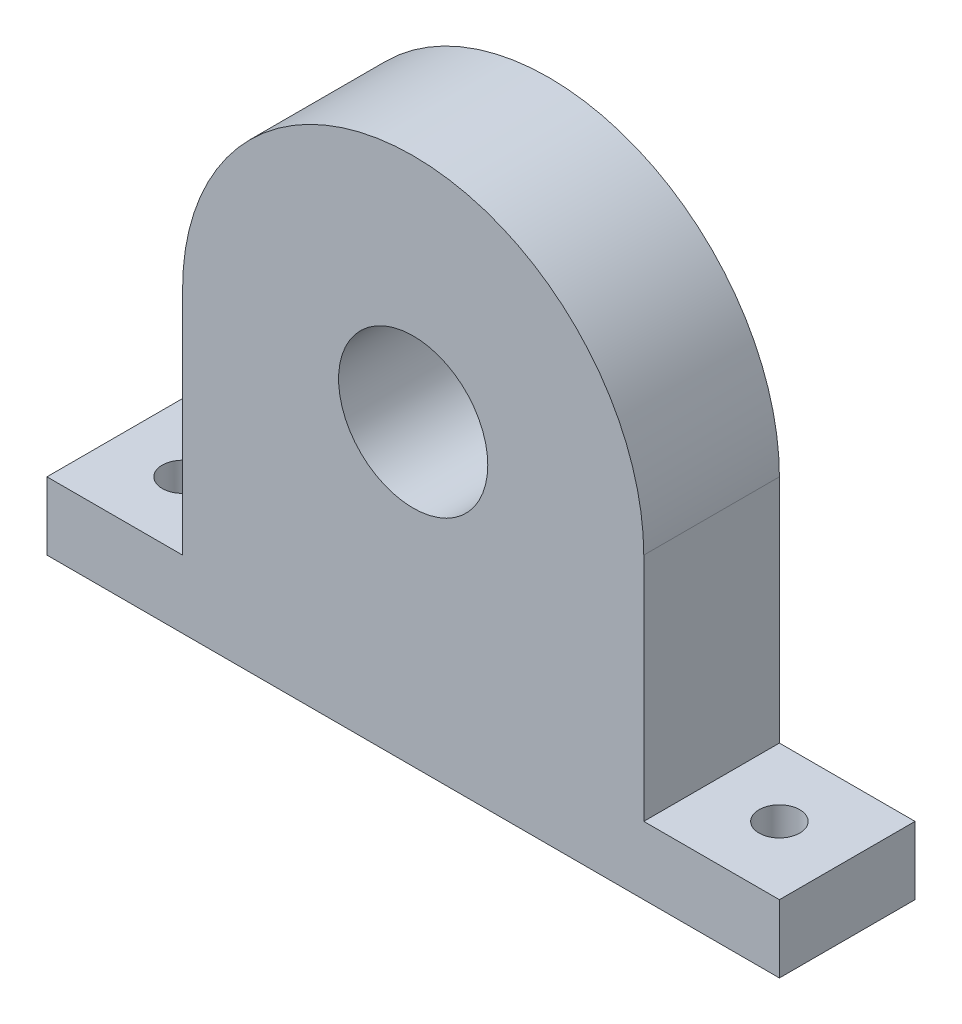
ISO-10303-21;
HEADER;
FILE_DESCRIPTION(('STEP AP214'),'2;1');
FILE_NAME('part.step','',(''),(''),'','','');
FILE_SCHEMA(('AUTOMOTIVE_DESIGN { 1 0 10303 214 1 1 1 1 }'));
ENDSEC;
DATA;
#1=APPLICATION_CONTEXT('core data for automotive mechanical design processes');
#2=APPLICATION_PROTOCOL_DEFINITION('international standard','automotive_design',2000,#1);
#3=PRODUCT_CONTEXT('',#1,'mechanical');
#4=PRODUCT('Part','Part','',(#3));
#5=PRODUCT_RELATED_PRODUCT_CATEGORY('part','',(#4));
#6=PRODUCT_DEFINITION_FORMATION('','',#4);
#7=PRODUCT_DEFINITION_CONTEXT('part definition',#1,'design');
#8=PRODUCT_DEFINITION('design','',#6,#7);
#9=PRODUCT_DEFINITION_SHAPE('','',#8);
#10=(LENGTH_UNIT() NAMED_UNIT(*) SI_UNIT(.MILLI.,.METRE.));
#11=(NAMED_UNIT(*) PLANE_ANGLE_UNIT() SI_UNIT($,.RADIAN.));
#12=(NAMED_UNIT(*) SI_UNIT($,.STERADIAN.) SOLID_ANGLE_UNIT());
#13=UNCERTAINTY_MEASURE_WITH_UNIT(LENGTH_MEASURE(1.E-05),#10,'distance_accuracy_value','');
#14=(GEOMETRIC_REPRESENTATION_CONTEXT(3) GLOBAL_UNCERTAINTY_ASSIGNED_CONTEXT((#13)) GLOBAL_UNIT_ASSIGNED_CONTEXT((#10,
#11,#12)) REPRESENTATION_CONTEXT('',''));
#15=CARTESIAN_POINT('',(0.,0.,0.));
#16=DIRECTION('',(0.,0.,1.));
#17=DIRECTION('',(1.,0.,0.));
#18=AXIS2_PLACEMENT_3D('',#15,#16,#17);
#19=CARTESIAN_POINT('',(0.,0.,10.));
#20=DIRECTION('',(0.,0.,1.));
#21=DIRECTION('',(1.,0.,0.));
#22=AXIS2_PLACEMENT_3D('',#19,#20,#21);
#23=PLANE('',#22);
#24=CARTESIAN_POINT('',(0.,0.,10.));
#25=DIRECTION('',(0.,0.,1.));
#26=DIRECTION('',(1.,0.,0.));
#27=AXIS2_PLACEMENT_3D('',#24,#25,#26);
#28=CIRCLE('',#27,17.);
#29=CARTESIAN_POINT('',(17.,0.,10.));
#30=VERTEX_POINT('',#29);
#31=CARTESIAN_POINT('',(-17.,0.,10.));
#32=VERTEX_POINT('',#31);
#33=EDGE_CURVE('E144',#30,#32,#28,.T.);
#34=ORIENTED_EDGE('',*,*,#33,.T.);
#35=DIRECTION('',(0.,-1.,0.));
#36=VECTOR('',#35,1.);
#37=CARTESIAN_POINT('',(-17.,0.,10.));
#38=LINE('',#37,#36);
#39=CARTESIAN_POINT('',(-17.,-17.,10.));
#40=VERTEX_POINT('',#39);
#41=EDGE_CURVE('E92',#32,#40,#38,.T.);
#42=ORIENTED_EDGE('',*,*,#41,.T.);
#43=DIRECTION('',(-1.,0.,0.));
#44=VECTOR('',#43,1.);
#45=CARTESIAN_POINT('',(-17.,-17.,10.));
#46=LINE('',#45,#44);
#47=CARTESIAN_POINT('',(-27.,-17.,10.));
#48=VERTEX_POINT('',#47);
#49=EDGE_CURVE('E159',#40,#48,#46,.T.);
#50=ORIENTED_EDGE('',*,*,#49,.T.);
#51=DIRECTION('',(0.,-1.,0.));
#52=VECTOR('',#51,1.);
#53=CARTESIAN_POINT('',(-27.,-17.,10.));
#54=LINE('',#53,#52);
#55=CARTESIAN_POINT('',(-27.,-22.,10.));
#56=VERTEX_POINT('',#55);
#57=EDGE_CURVE('E172',#48,#56,#54,.T.);
#58=ORIENTED_EDGE('',*,*,#57,.T.);
#59=DIRECTION('',(1.,0.,0.));
#60=VECTOR('',#59,1.);
#61=CARTESIAN_POINT('',(27.,-22.,10.));
#62=LINE('',#61,#60);
#63=CARTESIAN_POINT('',(27.,-22.,10.));
#64=VERTEX_POINT('',#63);
#65=EDGE_CURVE('E111',#56,#64,#62,.T.);
#66=ORIENTED_EDGE('',*,*,#65,.T.);
#67=DIRECTION('',(0.,1.,0.));
#68=VECTOR('',#67,1.);
#69=CARTESIAN_POINT('',(27.,-17.,10.));
#70=LINE('',#69,#68);
#71=CARTESIAN_POINT('',(27.,-17.,10.));
#72=VERTEX_POINT('',#71);
#73=EDGE_CURVE('E105',#64,#72,#70,.T.);
#74=ORIENTED_EDGE('',*,*,#73,.T.);
#75=DIRECTION('',(-1.,0.,0.));
#76=VECTOR('',#75,1.);
#77=CARTESIAN_POINT('',(27.,-17.,10.));
#78=LINE('',#77,#76);
#79=CARTESIAN_POINT('',(17.,-17.,10.));
#80=VERTEX_POINT('',#79);
#81=EDGE_CURVE('E109',#72,#80,#78,.T.);
#82=ORIENTED_EDGE('',*,*,#81,.T.);
#83=DIRECTION('',(0.,1.,0.));
#84=VECTOR('',#83,1.);
#85=CARTESIAN_POINT('',(17.,0.,10.));
#86=LINE('',#85,#84);
#87=EDGE_CURVE('E49',#80,#30,#86,.T.);
#88=ORIENTED_EDGE('',*,*,#87,.T.);
#89=EDGE_LOOP('',(#34,#42,#50,#58,#66,#74,#82,#88));
#90=FACE_BOUND('',#89,.T.);
#91=CARTESIAN_POINT('',(0.,0.,10.));
#92=DIRECTION('',(0.,0.,1.));
#93=DIRECTION('',(1.,0.,0.));
#94=AXIS2_PLACEMENT_3D('',#91,#92,#93);
#95=CIRCLE('',#94,5.5);
#96=CARTESIAN_POINT('',(5.5,0.,10.));
#97=VERTEX_POINT('',#96);
#98=EDGE_CURVE('E133',#97,#97,#95,.T.);
#99=ORIENTED_EDGE('',*,*,#98,.F.);
#100=EDGE_LOOP('',(#99));
#101=FACE_BOUND('',#100,.T.);
#102=ADVANCED_FACE('F32',(#90,#101),#23,.T.);
#103=CARTESIAN_POINT('',(0.,0.,0.));
#104=DIRECTION('',(0.,0.,1.));
#105=DIRECTION('',(1.,0.,0.));
#106=AXIS2_PLACEMENT_3D('',#103,#104,#105);
#107=PLANE('',#106);
#108=CARTESIAN_POINT('',(0.,0.,0.));
#109=DIRECTION('',(0.,0.,1.));
#110=DIRECTION('',(1.,0.,0.));
#111=AXIS2_PLACEMENT_3D('',#108,#109,#110);
#112=CIRCLE('',#111,17.);
#113=CARTESIAN_POINT('',(17.,0.,0.));
#114=VERTEX_POINT('',#113);
#115=CARTESIAN_POINT('',(-17.,0.,0.));
#116=VERTEX_POINT('',#115);
#117=EDGE_CURVE('E129',#114,#116,#112,.T.);
#118=ORIENTED_EDGE('',*,*,#117,.F.);
#119=DIRECTION('',(0.,1.,0.));
#120=VECTOR('',#119,1.);
#121=CARTESIAN_POINT('',(17.,0.,0.));
#122=LINE('',#121,#120);
#123=CARTESIAN_POINT('',(17.,-17.,0.));
#124=VERTEX_POINT('',#123);
#125=EDGE_CURVE('E84',#124,#114,#122,.T.);
#126=ORIENTED_EDGE('',*,*,#125,.F.);
#127=DIRECTION('',(-1.,0.,0.));
#128=VECTOR('',#127,1.);
#129=CARTESIAN_POINT('',(27.,-17.,0.));
#130=LINE('',#129,#128);
#131=CARTESIAN_POINT('',(27.,-17.,0.));
#132=VERTEX_POINT('',#131);
#133=EDGE_CURVE('E78',#132,#124,#130,.T.);
#134=ORIENTED_EDGE('',*,*,#133,.F.);
#135=DIRECTION('',(0.,1.,0.));
#136=VECTOR('',#135,1.);
#137=CARTESIAN_POINT('',(27.,-17.,0.));
#138=LINE('',#137,#136);
#139=CARTESIAN_POINT('',(27.,-22.,0.));
#140=VERTEX_POINT('',#139);
#141=EDGE_CURVE('E119',#140,#132,#138,.T.);
#142=ORIENTED_EDGE('',*,*,#141,.F.);
#143=DIRECTION('',(1.,0.,0.));
#144=VECTOR('',#143,1.);
#145=CARTESIAN_POINT('',(27.,-22.,0.));
#146=LINE('',#145,#144);
#147=CARTESIAN_POINT('',(-27.,-22.,0.));
#148=VERTEX_POINT('',#147);
#149=EDGE_CURVE('E139',#148,#140,#146,.T.);
#150=ORIENTED_EDGE('',*,*,#149,.F.);
#151=DIRECTION('',(0.,-1.,0.));
#152=VECTOR('',#151,1.);
#153=CARTESIAN_POINT('',(-27.,-17.,0.));
#154=LINE('',#153,#152);
#155=CARTESIAN_POINT('',(-27.,-17.,0.));
#156=VERTEX_POINT('',#155);
#157=EDGE_CURVE('E137',#156,#148,#154,.T.);
#158=ORIENTED_EDGE('',*,*,#157,.F.);
#159=DIRECTION('',(-1.,0.,0.));
#160=VECTOR('',#159,1.);
#161=CARTESIAN_POINT('',(-17.,-17.,0.));
#162=LINE('',#161,#160);
#163=CARTESIAN_POINT('',(-17.,-17.,0.));
#164=VERTEX_POINT('',#163);
#165=EDGE_CURVE('E135',#164,#156,#162,.T.);
#166=ORIENTED_EDGE('',*,*,#165,.F.);
#167=DIRECTION('',(0.,-1.,0.));
#168=VECTOR('',#167,1.);
#169=CARTESIAN_POINT('',(-17.,0.,0.));
#170=LINE('',#169,#168);
#171=EDGE_CURVE('E132',#116,#164,#170,.T.);
#172=ORIENTED_EDGE('',*,*,#171,.F.);
#173=EDGE_LOOP('',(#118,#126,#134,#142,#150,#158,#166,#172));
#174=FACE_BOUND('',#173,.T.);
#175=CARTESIAN_POINT('',(0.,0.,0.));
#176=DIRECTION('',(0.,0.,1.));
#177=DIRECTION('',(1.,0.,0.));
#178=AXIS2_PLACEMENT_3D('',#175,#176,#177);
#179=CIRCLE('',#178,5.5);
#180=CARTESIAN_POINT('',(5.5,0.,0.));
#181=VERTEX_POINT('',#180);
#182=EDGE_CURVE('E178',#181,#181,#179,.T.);
#183=ORIENTED_EDGE('',*,*,#182,.T.);
#184=EDGE_LOOP('',(#183));
#185=FACE_BOUND('',#184,.T.);
#186=ADVANCED_FACE('F163',(#174,#185),#107,.F.);
#187=CARTESIAN_POINT('',(0.,0.,10.));
#188=DIRECTION('',(0.,0.,-1.));
#189=DIRECTION('',(-1.,0.,0.));
#190=AXIS2_PLACEMENT_3D('',#187,#188,#189);
#191=CYLINDRICAL_SURFACE('',#190,17.);
#192=ORIENTED_EDGE('',*,*,#117,.T.);
#193=DIRECTION('',(0.,0.,-1.));
#194=VECTOR('',#193,1.);
#195=CARTESIAN_POINT('',(-17.,0.,10.));
#196=LINE('',#195,#194);
#197=EDGE_CURVE('E11',#32,#116,#196,.T.);
#198=ORIENTED_EDGE('',*,*,#197,.F.);
#199=ORIENTED_EDGE('',*,*,#33,.F.);
#200=DIRECTION('',(0.,0.,-1.));
#201=VECTOR('',#200,1.);
#202=CARTESIAN_POINT('',(17.,0.,10.));
#203=LINE('',#202,#201);
#204=EDGE_CURVE('E125',#30,#114,#203,.T.);
#205=ORIENTED_EDGE('',*,*,#204,.T.);
#206=EDGE_LOOP('',(#192,#198,#199,#205));
#207=FACE_BOUND('',#206,.T.);
#208=ADVANCED_FACE('F34',(#207),#191,.T.);
#209=CARTESIAN_POINT('',(-17.,0.,10.));
#210=DIRECTION('',(1.,0.,0.));
#211=DIRECTION('',(0.,1.,0.));
#212=AXIS2_PLACEMENT_3D('',#209,#210,#211);
#213=PLANE('',#212);
#214=ORIENTED_EDGE('',*,*,#171,.T.);
#215=DIRECTION('',(0.,0.,-1.));
#216=VECTOR('',#215,1.);
#217=CARTESIAN_POINT('',(-17.,-17.,10.));
#218=LINE('',#217,#216);
#219=EDGE_CURVE('E41',#40,#164,#218,.T.);
#220=ORIENTED_EDGE('',*,*,#219,.F.);
#221=ORIENTED_EDGE('',*,*,#41,.F.);
#222=ORIENTED_EDGE('',*,*,#197,.T.);
#223=EDGE_LOOP('',(#214,#220,#221,#222));
#224=FACE_BOUND('',#223,.T.);
#225=ADVANCED_FACE('F206',(#224),#213,.F.);
#226=CARTESIAN_POINT('',(-17.,-17.,10.));
#227=DIRECTION('',(0.,-1.,0.));
#228=DIRECTION('',(0.,0.,-1.));
#229=AXIS2_PLACEMENT_3D('',#226,#227,#228);
#230=PLANE('',#229);
#231=CARTESIAN_POINT('',(-22.,-17.,5.));
#232=DIRECTION('',(0.,-1.,0.));
#233=DIRECTION('',(0.,0.,-1.));
#234=AXIS2_PLACEMENT_3D('',#231,#232,#233);
#235=CIRCLE('',#234,1.5);
#236=CARTESIAN_POINT('',(-22.,-17.,3.5));
#237=VERTEX_POINT('',#236);
#238=EDGE_CURVE('E187',#237,#237,#235,.T.);
#239=ORIENTED_EDGE('',*,*,#238,.T.);
#240=EDGE_LOOP('',(#239));
#241=FACE_BOUND('',#240,.T.);
#242=ORIENTED_EDGE('',*,*,#165,.T.);
#243=DIRECTION('',(0.,0.,-1.));
#244=VECTOR('',#243,1.);
#245=CARTESIAN_POINT('',(-27.,-17.,10.));
#246=LINE('',#245,#244);
#247=EDGE_CURVE('E151',#48,#156,#246,.T.);
#248=ORIENTED_EDGE('',*,*,#247,.F.);
#249=ORIENTED_EDGE('',*,*,#49,.F.);
#250=ORIENTED_EDGE('',*,*,#219,.T.);
#251=EDGE_LOOP('',(#242,#248,#249,#250));
#252=FACE_BOUND('',#251,.T.);
#253=ADVANCED_FACE('F157',(#241,#252),#230,.F.);
#254=CARTESIAN_POINT('',(-27.,-17.,10.));
#255=DIRECTION('',(1.,0.,0.));
#256=DIRECTION('',(0.,0.,-1.));
#257=AXIS2_PLACEMENT_3D('',#254,#255,#256);
#258=PLANE('',#257);
#259=ORIENTED_EDGE('',*,*,#157,.T.);
#260=DIRECTION('',(0.,0.,-1.));
#261=VECTOR('',#260,1.);
#262=CARTESIAN_POINT('',(-27.,-22.,10.));
#263=LINE('',#262,#261);
#264=EDGE_CURVE('E148',#56,#148,#263,.T.);
#265=ORIENTED_EDGE('',*,*,#264,.F.);
#266=ORIENTED_EDGE('',*,*,#57,.F.);
#267=ORIENTED_EDGE('',*,*,#247,.T.);
#268=EDGE_LOOP('',(#259,#265,#266,#267));
#269=FACE_BOUND('',#268,.T.);
#270=ADVANCED_FACE('F168',(#269),#258,.F.);
#271=CARTESIAN_POINT('',(27.,-22.,10.));
#272=DIRECTION('',(0.,1.,0.));
#273=DIRECTION('',(-1.,0.,0.));
#274=AXIS2_PLACEMENT_3D('',#271,#272,#273);
#275=PLANE('',#274);
#276=CARTESIAN_POINT('',(-22.,-22.,5.));
#277=DIRECTION('',(0.,1.,0.));
#278=DIRECTION('',(0.,0.,1.));
#279=AXIS2_PLACEMENT_3D('',#276,#277,#278);
#280=CIRCLE('',#279,1.5);
#281=CARTESIAN_POINT('',(-22.,-22.,6.5));
#282=VERTEX_POINT('',#281);
#283=EDGE_CURVE('E192',#282,#282,#280,.T.);
#284=ORIENTED_EDGE('',*,*,#283,.T.);
#285=EDGE_LOOP('',(#284));
#286=FACE_BOUND('',#285,.T.);
#287=CARTESIAN_POINT('',(22.,-22.,5.));
#288=DIRECTION('',(0.,1.,0.));
#289=DIRECTION('',(0.,0.,1.));
#290=AXIS2_PLACEMENT_3D('',#287,#288,#289);
#291=CIRCLE('',#290,1.5);
#292=CARTESIAN_POINT('',(22.,-22.,6.5));
#293=VERTEX_POINT('',#292);
#294=EDGE_CURVE('E181',#293,#293,#291,.T.);
#295=ORIENTED_EDGE('',*,*,#294,.T.);
#296=EDGE_LOOP('',(#295));
#297=FACE_BOUND('',#296,.T.);
#298=ORIENTED_EDGE('',*,*,#149,.T.);
#299=DIRECTION('',(0.,0.,-1.));
#300=VECTOR('',#299,1.);
#301=CARTESIAN_POINT('',(27.,-22.,10.));
#302=LINE('',#301,#300);
#303=EDGE_CURVE('E120',#64,#140,#302,.T.);
#304=ORIENTED_EDGE('',*,*,#303,.F.);
#305=ORIENTED_EDGE('',*,*,#65,.F.);
#306=ORIENTED_EDGE('',*,*,#264,.T.);
#307=EDGE_LOOP('',(#298,#304,#305,#306));
#308=FACE_BOUND('',#307,.T.);
#309=ADVANCED_FACE('F171',(#286,#297,#308),#275,.F.);
#310=CARTESIAN_POINT('',(27.,-17.,10.));
#311=DIRECTION('',(-1.,0.,0.));
#312=DIRECTION('',(0.,0.,1.));
#313=AXIS2_PLACEMENT_3D('',#310,#311,#312);
#314=PLANE('',#313);
#315=ORIENTED_EDGE('',*,*,#141,.T.);
#316=DIRECTION('',(0.,0.,-1.));
#317=VECTOR('',#316,1.);
#318=CARTESIAN_POINT('',(27.,-17.,10.));
#319=LINE('',#318,#317);
#320=EDGE_CURVE('E116',#72,#132,#319,.T.);
#321=ORIENTED_EDGE('',*,*,#320,.F.);
#322=ORIENTED_EDGE('',*,*,#73,.F.);
#323=ORIENTED_EDGE('',*,*,#303,.T.);
#324=EDGE_LOOP('',(#315,#321,#322,#323));
#325=FACE_BOUND('',#324,.T.);
#326=ADVANCED_FACE('F117',(#325),#314,.F.);
#327=CARTESIAN_POINT('',(27.,-17.,10.));
#328=DIRECTION('',(0.,-1.,0.));
#329=DIRECTION('',(0.,0.,-1.));
#330=AXIS2_PLACEMENT_3D('',#327,#328,#329);
#331=PLANE('',#330);
#332=CARTESIAN_POINT('',(22.,-17.,5.));
#333=DIRECTION('',(0.,1.,0.));
#334=DIRECTION('',(0.,0.,1.));
#335=AXIS2_PLACEMENT_3D('',#332,#333,#334);
#336=CIRCLE('',#335,1.5);
#337=CARTESIAN_POINT('',(22.,-17.,6.5));
#338=VERTEX_POINT('',#337);
#339=EDGE_CURVE('E184',#338,#338,#336,.T.);
#340=ORIENTED_EDGE('',*,*,#339,.F.);
#341=EDGE_LOOP('',(#340));
#342=FACE_BOUND('',#341,.T.);
#343=ORIENTED_EDGE('',*,*,#133,.T.);
#344=DIRECTION('',(0.,0.,-1.));
#345=VECTOR('',#344,1.);
#346=CARTESIAN_POINT('',(17.,-17.,10.));
#347=LINE('',#346,#345);
#348=EDGE_CURVE('E121',#80,#124,#347,.T.);
#349=ORIENTED_EDGE('',*,*,#348,.F.);
#350=ORIENTED_EDGE('',*,*,#81,.F.);
#351=ORIENTED_EDGE('',*,*,#320,.T.);
#352=EDGE_LOOP('',(#343,#349,#350,#351));
#353=FACE_BOUND('',#352,.T.);
#354=ADVANCED_FACE('F123',(#342,#353),#331,.F.);
#355=CARTESIAN_POINT('',(17.,0.,10.));
#356=DIRECTION('',(-1.,0.,0.));
#357=DIRECTION('',(0.,-1.,0.));
#358=AXIS2_PLACEMENT_3D('',#355,#356,#357);
#359=PLANE('',#358);
#360=ORIENTED_EDGE('',*,*,#125,.T.);
#361=ORIENTED_EDGE('',*,*,#204,.F.);
#362=ORIENTED_EDGE('',*,*,#87,.F.);
#363=ORIENTED_EDGE('',*,*,#348,.T.);
#364=EDGE_LOOP('',(#360,#361,#362,#363));
#365=FACE_BOUND('',#364,.T.);
#366=ADVANCED_FACE('F223',(#365),#359,.F.);
#367=CARTESIAN_POINT('',(0.,0.,10.));
#368=DIRECTION('',(0.,0.,-1.));
#369=DIRECTION('',(-1.,0.,0.));
#370=AXIS2_PLACEMENT_3D('',#367,#368,#369);
#371=CYLINDRICAL_SURFACE('',#370,5.5);
#372=ORIENTED_EDGE('',*,*,#98,.T.);
#373=EDGE_LOOP('',(#372));
#374=FACE_BOUND('',#373,.T.);
#375=ORIENTED_EDGE('',*,*,#182,.F.);
#376=EDGE_LOOP('',(#375));
#377=FACE_BOUND('',#376,.T.);
#378=ADVANCED_FACE('F220',(#374,#377),#371,.F.);
#379=CARTESIAN_POINT('',(22.,-22.,5.));
#380=DIRECTION('',(0.,1.,0.));
#381=DIRECTION('',(0.,0.,1.));
#382=AXIS2_PLACEMENT_3D('',#379,#380,#381);
#383=CYLINDRICAL_SURFACE('',#382,1.5);
#384=ORIENTED_EDGE('',*,*,#294,.F.);
#385=EDGE_LOOP('',(#384));
#386=FACE_BOUND('',#385,.T.);
#387=ORIENTED_EDGE('',*,*,#339,.T.);
#388=EDGE_LOOP('',(#387));
#389=FACE_BOUND('',#388,.T.);
#390=ADVANCED_FACE('F201',(#386,#389),#383,.F.);
#391=CARTESIAN_POINT('',(-22.,-22.,5.));
#392=DIRECTION('',(0.,1.,0.));
#393=DIRECTION('',(0.,0.,1.));
#394=AXIS2_PLACEMENT_3D('',#391,#392,#393);
#395=CYLINDRICAL_SURFACE('',#394,1.5);
#396=ORIENTED_EDGE('',*,*,#283,.F.);
#397=EDGE_LOOP('',(#396));
#398=FACE_BOUND('',#397,.T.);
#399=ORIENTED_EDGE('',*,*,#238,.F.);
#400=EDGE_LOOP('',(#399));
#401=FACE_BOUND('',#400,.T.);
#402=ADVANCED_FACE('F198',(#398,#401),#395,.F.);
#403=CLOSED_SHELL('',(#102,#186,#208,#225,#253,#270,#309,#326,#354,#366,#378,#390,#402));
#404=MANIFOLD_SOLID_BREP('B2',#403);
#405=ADVANCED_BREP_SHAPE_REPRESENTATION('',(#18,#404),#14);
#406=SHAPE_DEFINITION_REPRESENTATION(#9,#405);
ENDSEC;
END-ISO-10303-21;
